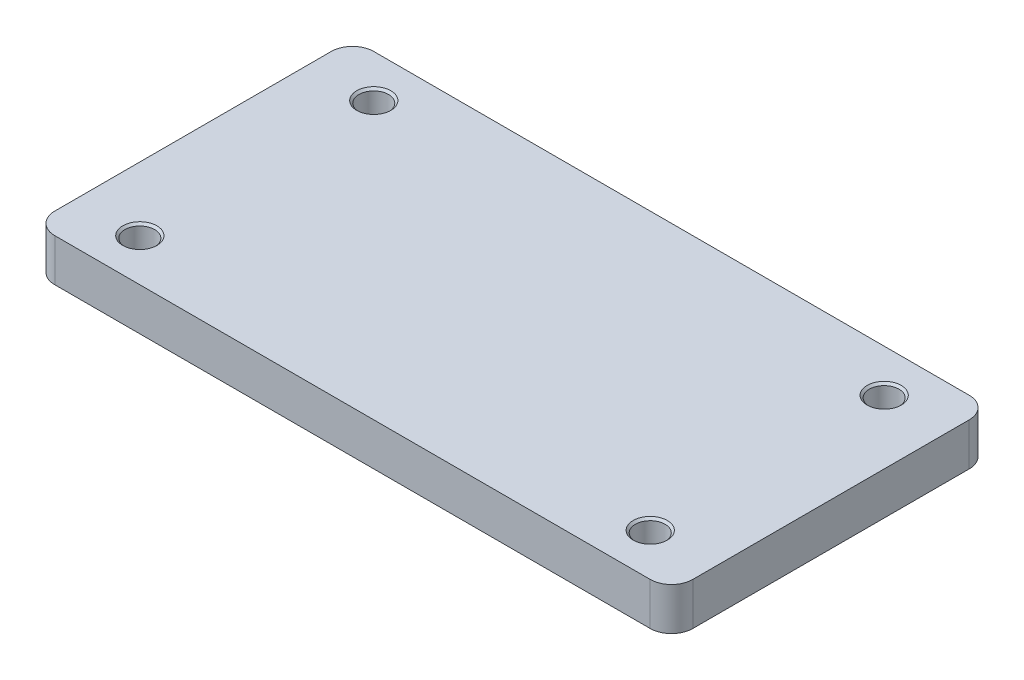
ISO-10303-21;
HEADER;
FILE_DESCRIPTION(('STEP AP214'),'2;1');
FILE_NAME('part.step','',(''),(''),'','','');
FILE_SCHEMA(('AUTOMOTIVE_DESIGN { 1 0 10303 214 1 1 1 1 }'));
ENDSEC;
DATA;
#1=APPLICATION_CONTEXT('core data for automotive mechanical design processes');
#2=APPLICATION_PROTOCOL_DEFINITION('international standard','automotive_design',2000,#1);
#3=PRODUCT_CONTEXT('',#1,'mechanical');
#4=PRODUCT('Part','Part','',(#3));
#5=PRODUCT_RELATED_PRODUCT_CATEGORY('part','',(#4));
#6=PRODUCT_DEFINITION_FORMATION('','',#4);
#7=PRODUCT_DEFINITION_CONTEXT('part definition',#1,'design');
#8=PRODUCT_DEFINITION('design','',#6,#7);
#9=PRODUCT_DEFINITION_SHAPE('','',#8);
#10=(LENGTH_UNIT() NAMED_UNIT(*) SI_UNIT(.MILLI.,.METRE.));
#11=(NAMED_UNIT(*) PLANE_ANGLE_UNIT() SI_UNIT($,.RADIAN.));
#12=(NAMED_UNIT(*) SI_UNIT($,.STERADIAN.) SOLID_ANGLE_UNIT());
#13=UNCERTAINTY_MEASURE_WITH_UNIT(LENGTH_MEASURE(1.E-05),#10,'distance_accuracy_value','');
#14=(GEOMETRIC_REPRESENTATION_CONTEXT(3) GLOBAL_UNCERTAINTY_ASSIGNED_CONTEXT((#13)) GLOBAL_UNIT_ASSIGNED_CONTEXT((#10,
#11,#12)) REPRESENTATION_CONTEXT('',''));
#15=CARTESIAN_POINT('',(0.,0.,0.));
#16=DIRECTION('',(0.,0.,1.));
#17=DIRECTION('',(1.,0.,0.));
#18=AXIS2_PLACEMENT_3D('',#15,#16,#17);
#19=CARTESIAN_POINT('',(150.,10.,-75.));
#20=DIRECTION('',(-1.,0.,0.));
#21=DIRECTION('',(0.,0.,1.));
#22=AXIS2_PLACEMENT_3D('',#19,#20,#21);
#23=PLANE('',#22);
#24=DIRECTION('',(0.,0.,-1.));
#25=VECTOR('',#24,1.);
#26=CARTESIAN_POINT('',(150.,-10.,-75.));
#27=LINE('',#26,#25);
#28=CARTESIAN_POINT('',(150.,-10.,65.));
#29=VERTEX_POINT('',#28);
#30=CARTESIAN_POINT('',(150.,-10.,-65.));
#31=VERTEX_POINT('',#30);
#32=EDGE_CURVE('E138',#29,#31,#27,.T.);
#33=ORIENTED_EDGE('',*,*,#32,.T.);
#34=DIRECTION('',(0.,-1.,0.));
#35=VECTOR('',#34,1.);
#36=CARTESIAN_POINT('',(150.,10.,-65.));
#37=LINE('',#36,#35);
#38=CARTESIAN_POINT('',(150.,10.,-65.));
#39=VERTEX_POINT('',#38);
#40=EDGE_CURVE('E161',#31,#39,#37,.F.);
#41=ORIENTED_EDGE('',*,*,#40,.T.);
#42=DIRECTION('',(0.,0.,-1.));
#43=VECTOR('',#42,1.);
#44=CARTESIAN_POINT('',(150.,10.,-75.));
#45=LINE('',#44,#43);
#46=CARTESIAN_POINT('',(150.,10.,65.));
#47=VERTEX_POINT('',#46);
#48=EDGE_CURVE('E136',#47,#39,#45,.T.);
#49=ORIENTED_EDGE('',*,*,#48,.F.);
#50=DIRECTION('',(0.,-1.,0.));
#51=VECTOR('',#50,1.);
#52=CARTESIAN_POINT('',(150.,10.,65.));
#53=LINE('',#52,#51);
#54=EDGE_CURVE('E158',#47,#29,#53,.T.);
#55=ORIENTED_EDGE('',*,*,#54,.T.);
#56=EDGE_LOOP('',(#33,#41,#49,#55));
#57=FACE_BOUND('',#56,.T.);
#58=ADVANCED_FACE('F43',(#57),#23,.F.);
#59=CARTESIAN_POINT('',(150.,10.,-75.));
#60=DIRECTION('',(0.,0.,1.));
#61=DIRECTION('',(1.,0.,0.));
#62=AXIS2_PLACEMENT_3D('',#59,#60,#61);
#63=PLANE('',#62);
#64=DIRECTION('',(-1.,0.,0.));
#65=VECTOR('',#64,1.);
#66=CARTESIAN_POINT('',(150.,-10.,-75.));
#67=LINE('',#66,#65);
#68=CARTESIAN_POINT('',(140.,-10.,-75.));
#69=VERTEX_POINT('',#68);
#70=CARTESIAN_POINT('',(-140.,-10.,-75.));
#71=VERTEX_POINT('',#70);
#72=EDGE_CURVE('E134',#69,#71,#67,.T.);
#73=ORIENTED_EDGE('',*,*,#72,.T.);
#74=DIRECTION('',(0.,-1.,0.));
#75=VECTOR('',#74,1.);
#76=CARTESIAN_POINT('',(-140.,10.,-75.));
#77=LINE('',#76,#75);
#78=CARTESIAN_POINT('',(-140.,10.,-75.));
#79=VERTEX_POINT('',#78);
#80=EDGE_CURVE('E113',#71,#79,#77,.F.);
#81=ORIENTED_EDGE('',*,*,#80,.T.);
#82=DIRECTION('',(-1.,0.,0.));
#83=VECTOR('',#82,1.);
#84=CARTESIAN_POINT('',(150.,10.,-75.));
#85=LINE('',#84,#83);
#86=CARTESIAN_POINT('',(140.,10.,-75.));
#87=VERTEX_POINT('',#86);
#88=EDGE_CURVE('E177',#87,#79,#85,.T.);
#89=ORIENTED_EDGE('',*,*,#88,.F.);
#90=DIRECTION('',(0.,-1.,0.));
#91=VECTOR('',#90,1.);
#92=CARTESIAN_POINT('',(140.,10.,-75.));
#93=LINE('',#92,#91);
#94=EDGE_CURVE('E118',#87,#69,#93,.T.);
#95=ORIENTED_EDGE('',*,*,#94,.T.);
#96=EDGE_LOOP('',(#73,#81,#89,#95));
#97=FACE_BOUND('',#96,.T.);
#98=ADVANCED_FACE('F239',(#97),#63,.F.);
#99=CARTESIAN_POINT('',(-150.,10.,-75.));
#100=DIRECTION('',(1.,0.,0.));
#101=DIRECTION('',(0.,0.,-1.));
#102=AXIS2_PLACEMENT_3D('',#99,#100,#101);
#103=PLANE('',#102);
#104=DIRECTION('',(0.,0.,1.));
#105=VECTOR('',#104,1.);
#106=CARTESIAN_POINT('',(-150.,10.,-75.));
#107=LINE('',#106,#105);
#108=CARTESIAN_POINT('',(-150.,10.,-65.));
#109=VERTEX_POINT('',#108);
#110=CARTESIAN_POINT('',(-150.,10.,65.));
#111=VERTEX_POINT('',#110);
#112=EDGE_CURVE('E127',#109,#111,#107,.T.);
#113=ORIENTED_EDGE('',*,*,#112,.F.);
#114=DIRECTION('',(0.,-1.,0.));
#115=VECTOR('',#114,1.);
#116=CARTESIAN_POINT('',(-150.,10.,-65.));
#117=LINE('',#116,#115);
#118=CARTESIAN_POINT('',(-150.,-10.,-65.));
#119=VERTEX_POINT('',#118);
#120=EDGE_CURVE('E112',#109,#119,#117,.T.);
#121=ORIENTED_EDGE('',*,*,#120,.T.);
#122=DIRECTION('',(0.,0.,1.));
#123=VECTOR('',#122,1.);
#124=CARTESIAN_POINT('',(-150.,-10.,-75.));
#125=LINE('',#124,#123);
#126=CARTESIAN_POINT('',(-150.,-10.,65.));
#127=VERTEX_POINT('',#126);
#128=EDGE_CURVE('E125',#119,#127,#125,.T.);
#129=ORIENTED_EDGE('',*,*,#128,.T.);
#130=DIRECTION('',(0.,-1.,0.));
#131=VECTOR('',#130,1.);
#132=CARTESIAN_POINT('',(-150.,10.,65.));
#133=LINE('',#132,#131);
#134=EDGE_CURVE('E129',#127,#111,#133,.F.);
#135=ORIENTED_EDGE('',*,*,#134,.T.);
#136=EDGE_LOOP('',(#113,#121,#129,#135));
#137=FACE_BOUND('',#136,.T.);
#138=ADVANCED_FACE('F124',(#137),#103,.F.);
#139=CARTESIAN_POINT('',(150.,10.,75.));
#140=DIRECTION('',(0.,0.,-1.));
#141=DIRECTION('',(-1.,0.,0.));
#142=AXIS2_PLACEMENT_3D('',#139,#140,#141);
#143=PLANE('',#142);
#144=DIRECTION('',(1.,0.,0.));
#145=VECTOR('',#144,1.);
#146=CARTESIAN_POINT('',(150.,-10.,75.));
#147=LINE('',#146,#145);
#148=CARTESIAN_POINT('',(-140.,-10.,75.));
#149=VERTEX_POINT('',#148);
#150=CARTESIAN_POINT('',(140.,-10.,75.));
#151=VERTEX_POINT('',#150);
#152=EDGE_CURVE('E133',#149,#151,#147,.T.);
#153=ORIENTED_EDGE('',*,*,#152,.T.);
#154=DIRECTION('',(0.,-1.,0.));
#155=VECTOR('',#154,1.);
#156=CARTESIAN_POINT('',(140.,10.,75.));
#157=LINE('',#156,#155);
#158=CARTESIAN_POINT('',(140.,10.,75.));
#159=VERTEX_POINT('',#158);
#160=EDGE_CURVE('E11',#151,#159,#157,.F.);
#161=ORIENTED_EDGE('',*,*,#160,.T.);
#162=DIRECTION('',(1.,0.,0.));
#163=VECTOR('',#162,1.);
#164=CARTESIAN_POINT('',(150.,10.,75.));
#165=LINE('',#164,#163);
#166=CARTESIAN_POINT('',(-140.,10.,75.));
#167=VERTEX_POINT('',#166);
#168=EDGE_CURVE('E142',#167,#159,#165,.T.);
#169=ORIENTED_EDGE('',*,*,#168,.F.);
#170=DIRECTION('',(0.,-1.,0.));
#171=VECTOR('',#170,1.);
#172=CARTESIAN_POINT('',(-140.,10.,75.));
#173=LINE('',#172,#171);
#174=EDGE_CURVE('E51',#167,#149,#173,.T.);
#175=ORIENTED_EDGE('',*,*,#174,.T.);
#176=EDGE_LOOP('',(#153,#161,#169,#175));
#177=FACE_BOUND('',#176,.T.);
#178=ADVANCED_FACE('F164',(#177),#143,.F.);
#179=CARTESIAN_POINT('',(0.,10.,0.));
#180=DIRECTION('',(0.,-1.,0.));
#181=DIRECTION('',(0.,0.,-1.));
#182=AXIS2_PLACEMENT_3D('',#179,#180,#181);
#183=PLANE('',#182);
#184=CARTESIAN_POINT('',(-120.,10.,-55.));
#185=DIRECTION('',(0.,1.,0.));
#186=DIRECTION('',(0.,0.,1.));
#187=AXIS2_PLACEMENT_3D('',#184,#185,#186);
#188=CIRCLE('',#187,8.025);
#189=CARTESIAN_POINT('',(-120.,10.,-46.975));
#190=VERTEX_POINT('',#189);
#191=EDGE_CURVE('E221',#190,#190,#188,.T.);
#192=ORIENTED_EDGE('',*,*,#191,.F.);
#193=EDGE_LOOP('',(#192));
#194=FACE_BOUND('',#193,.T.);
#195=CARTESIAN_POINT('',(120.,10.,-55.));
#196=DIRECTION('',(0.,1.,0.));
#197=DIRECTION('',(0.,0.,1.));
#198=AXIS2_PLACEMENT_3D('',#195,#196,#197);
#199=CIRCLE('',#198,8.025);
#200=CARTESIAN_POINT('',(120.,10.,-46.975));
#201=VERTEX_POINT('',#200);
#202=EDGE_CURVE('E212',#201,#201,#199,.T.);
#203=ORIENTED_EDGE('',*,*,#202,.F.);
#204=EDGE_LOOP('',(#203));
#205=FACE_BOUND('',#204,.T.);
#206=CARTESIAN_POINT('',(120.,10.,55.));
#207=DIRECTION('',(0.,1.,0.));
#208=DIRECTION('',(0.,0.,1.));
#209=AXIS2_PLACEMENT_3D('',#206,#207,#208);
#210=CIRCLE('',#209,8.02499999999999);
#211=CARTESIAN_POINT('',(120.,10.,63.025));
#212=VERTEX_POINT('',#211);
#213=EDGE_CURVE('E203',#212,#212,#210,.T.);
#214=ORIENTED_EDGE('',*,*,#213,.F.);
#215=EDGE_LOOP('',(#214));
#216=FACE_BOUND('',#215,.T.);
#217=CARTESIAN_POINT('',(-120.,10.,55.));
#218=DIRECTION('',(0.,1.,0.));
#219=DIRECTION('',(0.,0.,1.));
#220=AXIS2_PLACEMENT_3D('',#217,#218,#219);
#221=CIRCLE('',#220,8.025);
#222=CARTESIAN_POINT('',(-120.,10.,63.025));
#223=VERTEX_POINT('',#222);
#224=EDGE_CURVE('E191',#223,#223,#221,.T.);
#225=ORIENTED_EDGE('',*,*,#224,.F.);
#226=EDGE_LOOP('',(#225));
#227=FACE_BOUND('',#226,.T.);
#228=ORIENTED_EDGE('',*,*,#88,.T.);
#229=CARTESIAN_POINT('',(-140.,10.,-65.));
#230=DIRECTION('',(0.,-1.,0.));
#231=DIRECTION('',(0.,0.,-1.));
#232=AXIS2_PLACEMENT_3D('',#229,#230,#231);
#233=CIRCLE('',#232,10.);
#234=EDGE_CURVE('E156',#79,#109,#233,.F.);
#235=ORIENTED_EDGE('',*,*,#234,.T.);
#236=ORIENTED_EDGE('',*,*,#112,.T.);
#237=CARTESIAN_POINT('',(-140.,10.,65.));
#238=DIRECTION('',(0.,-1.,0.));
#239=DIRECTION('',(0.,0.,-1.));
#240=AXIS2_PLACEMENT_3D('',#237,#238,#239);
#241=CIRCLE('',#240,10.);
#242=EDGE_CURVE('E63',#111,#167,#241,.F.);
#243=ORIENTED_EDGE('',*,*,#242,.T.);
#244=ORIENTED_EDGE('',*,*,#168,.T.);
#245=CARTESIAN_POINT('',(140.,10.,65.));
#246=DIRECTION('',(0.,-1.,0.));
#247=DIRECTION('',(0.,0.,-1.));
#248=AXIS2_PLACEMENT_3D('',#245,#246,#247);
#249=CIRCLE('',#248,10.);
#250=EDGE_CURVE('E152',#159,#47,#249,.F.);
#251=ORIENTED_EDGE('',*,*,#250,.T.);
#252=ORIENTED_EDGE('',*,*,#48,.T.);
#253=CARTESIAN_POINT('',(140.,10.,-65.));
#254=DIRECTION('',(0.,-1.,0.));
#255=DIRECTION('',(0.,0.,-1.));
#256=AXIS2_PLACEMENT_3D('',#253,#254,#255);
#257=CIRCLE('',#256,10.);
#258=EDGE_CURVE('E154',#39,#87,#257,.F.);
#259=ORIENTED_EDGE('',*,*,#258,.T.);
#260=EDGE_LOOP('',(#228,#235,#236,#243,#244,#251,#252,#259));
#261=FACE_BOUND('',#260,.T.);
#262=ADVANCED_FACE('F227',(#194,#205,#216,#227,#261),#183,.F.);
#263=CARTESIAN_POINT('',(0.,-10.,0.));
#264=DIRECTION('',(0.,-1.,0.));
#265=DIRECTION('',(0.,0.,-1.));
#266=AXIS2_PLACEMENT_3D('',#263,#264,#265);
#267=PLANE('',#266);
#268=CARTESIAN_POINT('',(-120.,-10.,-55.));
#269=DIRECTION('',(0.,1.,0.));
#270=DIRECTION('',(0.,0.,1.));
#271=AXIS2_PLACEMENT_3D('',#268,#269,#270);
#272=CIRCLE('',#271,7.00000000000001);
#273=CARTESIAN_POINT('',(-120.,-10.,-48.));
#274=VERTEX_POINT('',#273);
#275=EDGE_CURVE('E215',#274,#274,#272,.T.);
#276=ORIENTED_EDGE('',*,*,#275,.T.);
#277=EDGE_LOOP('',(#276));
#278=FACE_BOUND('',#277,.T.);
#279=CARTESIAN_POINT('',(120.,-10.,-55.));
#280=DIRECTION('',(0.,1.,0.));
#281=DIRECTION('',(0.,0.,1.));
#282=AXIS2_PLACEMENT_3D('',#279,#280,#281);
#283=CIRCLE('',#282,7.00000000000001);
#284=CARTESIAN_POINT('',(120.,-10.,-48.));
#285=VERTEX_POINT('',#284);
#286=EDGE_CURVE('E206',#285,#285,#283,.T.);
#287=ORIENTED_EDGE('',*,*,#286,.T.);
#288=EDGE_LOOP('',(#287));
#289=FACE_BOUND('',#288,.T.);
#290=CARTESIAN_POINT('',(120.,-10.,55.));
#291=DIRECTION('',(0.,1.,0.));
#292=DIRECTION('',(0.,0.,1.));
#293=AXIS2_PLACEMENT_3D('',#290,#291,#292);
#294=CIRCLE('',#293,6.99999999999999);
#295=CARTESIAN_POINT('',(120.,-10.,62.));
#296=VERTEX_POINT('',#295);
#297=EDGE_CURVE('E195',#296,#296,#294,.T.);
#298=ORIENTED_EDGE('',*,*,#297,.T.);
#299=EDGE_LOOP('',(#298));
#300=FACE_BOUND('',#299,.T.);
#301=CARTESIAN_POINT('',(-120.,-10.,55.));
#302=DIRECTION('',(0.,1.,0.));
#303=DIRECTION('',(0.,0.,1.));
#304=AXIS2_PLACEMENT_3D('',#301,#302,#303);
#305=CIRCLE('',#304,7.00000000000001);
#306=CARTESIAN_POINT('',(-120.,-10.,62.));
#307=VERTEX_POINT('',#306);
#308=EDGE_CURVE('E182',#307,#307,#305,.T.);
#309=ORIENTED_EDGE('',*,*,#308,.T.);
#310=EDGE_LOOP('',(#309));
#311=FACE_BOUND('',#310,.T.);
#312=ORIENTED_EDGE('',*,*,#128,.F.);
#313=CARTESIAN_POINT('',(-140.,-10.,-65.));
#314=DIRECTION('',(0.,-1.,0.));
#315=DIRECTION('',(0.,0.,-1.));
#316=AXIS2_PLACEMENT_3D('',#313,#314,#315);
#317=CIRCLE('',#316,10.);
#318=EDGE_CURVE('E108',#119,#71,#317,.T.);
#319=ORIENTED_EDGE('',*,*,#318,.T.);
#320=ORIENTED_EDGE('',*,*,#72,.F.);
#321=CARTESIAN_POINT('',(140.,-10.,-65.));
#322=DIRECTION('',(0.,-1.,0.));
#323=DIRECTION('',(0.,0.,-1.));
#324=AXIS2_PLACEMENT_3D('',#321,#322,#323);
#325=CIRCLE('',#324,10.);
#326=EDGE_CURVE('E119',#69,#31,#325,.T.);
#327=ORIENTED_EDGE('',*,*,#326,.T.);
#328=ORIENTED_EDGE('',*,*,#32,.F.);
#329=CARTESIAN_POINT('',(140.,-10.,65.));
#330=DIRECTION('',(0.,-1.,0.));
#331=DIRECTION('',(0.,0.,-1.));
#332=AXIS2_PLACEMENT_3D('',#329,#330,#331);
#333=CIRCLE('',#332,10.);
#334=EDGE_CURVE('E145',#29,#151,#333,.T.);
#335=ORIENTED_EDGE('',*,*,#334,.T.);
#336=ORIENTED_EDGE('',*,*,#152,.F.);
#337=CARTESIAN_POINT('',(-140.,-10.,65.));
#338=DIRECTION('',(0.,-1.,0.));
#339=DIRECTION('',(0.,0.,-1.));
#340=AXIS2_PLACEMENT_3D('',#337,#338,#339);
#341=CIRCLE('',#340,10.);
#342=EDGE_CURVE('E128',#149,#127,#341,.T.);
#343=ORIENTED_EDGE('',*,*,#342,.T.);
#344=EDGE_LOOP('',(#312,#319,#320,#327,#328,#335,#336,#343));
#345=FACE_BOUND('',#344,.T.);
#346=ADVANCED_FACE('F131',(#278,#289,#300,#311,#345),#267,.T.);
#347=CARTESIAN_POINT('',(-140.,10.,-65.));
#348=DIRECTION('',(0.,-1.,0.));
#349=DIRECTION('',(0.,0.,-1.));
#350=AXIS2_PLACEMENT_3D('',#347,#348,#349);
#351=CYLINDRICAL_SURFACE('',#350,10.);
#352=ORIENTED_EDGE('',*,*,#234,.F.);
#353=ORIENTED_EDGE('',*,*,#80,.F.);
#354=ORIENTED_EDGE('',*,*,#318,.F.);
#355=ORIENTED_EDGE('',*,*,#120,.F.);
#356=EDGE_LOOP('',(#352,#353,#354,#355));
#357=FACE_BOUND('',#356,.T.);
#358=ADVANCED_FACE('F111',(#357),#351,.T.);
#359=CARTESIAN_POINT('',(140.,10.,-65.));
#360=DIRECTION('',(0.,-1.,0.));
#361=DIRECTION('',(0.,0.,-1.));
#362=AXIS2_PLACEMENT_3D('',#359,#360,#361);
#363=CYLINDRICAL_SURFACE('',#362,10.);
#364=ORIENTED_EDGE('',*,*,#258,.F.);
#365=ORIENTED_EDGE('',*,*,#40,.F.);
#366=ORIENTED_EDGE('',*,*,#326,.F.);
#367=ORIENTED_EDGE('',*,*,#94,.F.);
#368=EDGE_LOOP('',(#364,#365,#366,#367));
#369=FACE_BOUND('',#368,.T.);
#370=ADVANCED_FACE('F241',(#369),#363,.T.);
#371=CARTESIAN_POINT('',(140.,10.,65.));
#372=DIRECTION('',(0.,-1.,0.));
#373=DIRECTION('',(0.,0.,-1.));
#374=AXIS2_PLACEMENT_3D('',#371,#372,#373);
#375=CYLINDRICAL_SURFACE('',#374,10.);
#376=ORIENTED_EDGE('',*,*,#250,.F.);
#377=ORIENTED_EDGE('',*,*,#160,.F.);
#378=ORIENTED_EDGE('',*,*,#334,.F.);
#379=ORIENTED_EDGE('',*,*,#54,.F.);
#380=EDGE_LOOP('',(#376,#377,#378,#379));
#381=FACE_BOUND('',#380,.T.);
#382=ADVANCED_FACE('F171',(#381),#375,.T.);
#383=CARTESIAN_POINT('',(-140.,10.,65.));
#384=DIRECTION('',(0.,-1.,0.));
#385=DIRECTION('',(0.,0.,-1.));
#386=AXIS2_PLACEMENT_3D('',#383,#384,#385);
#387=CYLINDRICAL_SURFACE('',#386,10.);
#388=ORIENTED_EDGE('',*,*,#242,.F.);
#389=ORIENTED_EDGE('',*,*,#134,.F.);
#390=ORIENTED_EDGE('',*,*,#342,.F.);
#391=ORIENTED_EDGE('',*,*,#174,.F.);
#392=EDGE_LOOP('',(#388,#389,#390,#391));
#393=FACE_BOUND('',#392,.T.);
#394=ADVANCED_FACE('F45',(#393),#387,.T.);
#395=CARTESIAN_POINT('',(-120.,10.,55.));
#396=DIRECTION('',(0.,1.,0.));
#397=DIRECTION('',(0.,0.,1.));
#398=AXIS2_PLACEMENT_3D('',#395,#396,#397);
#399=CYLINDRICAL_SURFACE('',#398,7.00000000000001);
#400=ORIENTED_EDGE('',*,*,#308,.F.);
#401=EDGE_LOOP('',(#400));
#402=FACE_BOUND('',#401,.T.);
#403=CARTESIAN_POINT('',(-120.,8.975,55.));
#404=DIRECTION('',(0.,1.,0.));
#405=DIRECTION('',(0.,0.,1.));
#406=AXIS2_PLACEMENT_3D('',#403,#404,#405);
#407=CIRCLE('',#406,7.00000000000001);
#408=CARTESIAN_POINT('',(-120.,8.975,62.));
#409=VERTEX_POINT('',#408);
#410=EDGE_CURVE('E187',#409,#409,#407,.T.);
#411=ORIENTED_EDGE('',*,*,#410,.T.);
#412=EDGE_LOOP('',(#411));
#413=FACE_BOUND('',#412,.T.);
#414=ADVANCED_FACE('F263',(#402,#413),#399,.F.);
#415=CARTESIAN_POINT('',(-120.,10.,55.));
#416=DIRECTION('',(0.,1.,0.));
#417=DIRECTION('',(0.,0.,1.));
#418=AXIS2_PLACEMENT_3D('',#415,#416,#417);
#419=CONICAL_SURFACE('',#418,8.025,0.785398163397448);
#420=ORIENTED_EDGE('',*,*,#410,.F.);
#421=EDGE_LOOP('',(#420));
#422=FACE_BOUND('',#421,.T.);
#423=ORIENTED_EDGE('',*,*,#224,.T.);
#424=EDGE_LOOP('',(#423));
#425=FACE_BOUND('',#424,.T.);
#426=ADVANCED_FACE('F266',(#422,#425),#419,.F.);
#427=CARTESIAN_POINT('',(120.,10.,55.));
#428=DIRECTION('',(0.,1.,0.));
#429=DIRECTION('',(0.,0.,1.));
#430=AXIS2_PLACEMENT_3D('',#427,#428,#429);
#431=CYLINDRICAL_SURFACE('',#430,6.99999999999999);
#432=ORIENTED_EDGE('',*,*,#297,.F.);
#433=EDGE_LOOP('',(#432));
#434=FACE_BOUND('',#433,.T.);
#435=CARTESIAN_POINT('',(120.,8.975,55.));
#436=DIRECTION('',(0.,1.,0.));
#437=DIRECTION('',(0.,0.,1.));
#438=AXIS2_PLACEMENT_3D('',#435,#436,#437);
#439=CIRCLE('',#438,6.99999999999999);
#440=CARTESIAN_POINT('',(120.,8.975,62.));
#441=VERTEX_POINT('',#440);
#442=EDGE_CURVE('E200',#441,#441,#439,.T.);
#443=ORIENTED_EDGE('',*,*,#442,.T.);
#444=EDGE_LOOP('',(#443));
#445=FACE_BOUND('',#444,.T.);
#446=ADVANCED_FACE('F270',(#434,#445),#431,.F.);
#447=CARTESIAN_POINT('',(120.,10.,55.));
#448=DIRECTION('',(0.,1.,0.));
#449=DIRECTION('',(0.,0.,1.));
#450=AXIS2_PLACEMENT_3D('',#447,#448,#449);
#451=CONICAL_SURFACE('',#450,8.02499999999999,0.785398163397448);
#452=ORIENTED_EDGE('',*,*,#442,.F.);
#453=EDGE_LOOP('',(#452));
#454=FACE_BOUND('',#453,.T.);
#455=ORIENTED_EDGE('',*,*,#213,.T.);
#456=EDGE_LOOP('',(#455));
#457=FACE_BOUND('',#456,.T.);
#458=ADVANCED_FACE('F274',(#454,#457),#451,.F.);
#459=CARTESIAN_POINT('',(120.,10.,-55.));
#460=DIRECTION('',(0.,1.,0.));
#461=DIRECTION('',(0.,0.,1.));
#462=AXIS2_PLACEMENT_3D('',#459,#460,#461);
#463=CYLINDRICAL_SURFACE('',#462,7.00000000000001);
#464=ORIENTED_EDGE('',*,*,#286,.F.);
#465=EDGE_LOOP('',(#464));
#466=FACE_BOUND('',#465,.T.);
#467=CARTESIAN_POINT('',(120.,8.975,-55.));
#468=DIRECTION('',(0.,1.,0.));
#469=DIRECTION('',(0.,0.,1.));
#470=AXIS2_PLACEMENT_3D('',#467,#468,#469);
#471=CIRCLE('',#470,7.00000000000001);
#472=CARTESIAN_POINT('',(120.,8.975,-48.));
#473=VERTEX_POINT('',#472);
#474=EDGE_CURVE('E209',#473,#473,#471,.T.);
#475=ORIENTED_EDGE('',*,*,#474,.T.);
#476=EDGE_LOOP('',(#475));
#477=FACE_BOUND('',#476,.T.);
#478=ADVANCED_FACE('F278',(#466,#477),#463,.F.);
#479=CARTESIAN_POINT('',(120.,10.,-55.));
#480=DIRECTION('',(0.,1.,0.));
#481=DIRECTION('',(0.,0.,1.));
#482=AXIS2_PLACEMENT_3D('',#479,#480,#481);
#483=CONICAL_SURFACE('',#482,8.025,0.785398163397448);
#484=ORIENTED_EDGE('',*,*,#474,.F.);
#485=EDGE_LOOP('',(#484));
#486=FACE_BOUND('',#485,.T.);
#487=ORIENTED_EDGE('',*,*,#202,.T.);
#488=EDGE_LOOP('',(#487));
#489=FACE_BOUND('',#488,.T.);
#490=ADVANCED_FACE('F282',(#486,#489),#483,.F.);
#491=CARTESIAN_POINT('',(-120.,10.,-55.));
#492=DIRECTION('',(0.,1.,0.));
#493=DIRECTION('',(0.,0.,1.));
#494=AXIS2_PLACEMENT_3D('',#491,#492,#493);
#495=CYLINDRICAL_SURFACE('',#494,7.00000000000001);
#496=ORIENTED_EDGE('',*,*,#275,.F.);
#497=EDGE_LOOP('',(#496));
#498=FACE_BOUND('',#497,.T.);
#499=CARTESIAN_POINT('',(-120.,8.975,-55.));
#500=DIRECTION('',(0.,1.,0.));
#501=DIRECTION('',(0.,0.,1.));
#502=AXIS2_PLACEMENT_3D('',#499,#500,#501);
#503=CIRCLE('',#502,7.00000000000001);
#504=CARTESIAN_POINT('',(-120.,8.975,-48.));
#505=VERTEX_POINT('',#504);
#506=EDGE_CURVE('E218',#505,#505,#503,.T.);
#507=ORIENTED_EDGE('',*,*,#506,.T.);
#508=EDGE_LOOP('',(#507));
#509=FACE_BOUND('',#508,.T.);
#510=ADVANCED_FACE('F286',(#498,#509),#495,.F.);
#511=CARTESIAN_POINT('',(-120.,10.,-55.));
#512=DIRECTION('',(0.,1.,0.));
#513=DIRECTION('',(0.,0.,1.));
#514=AXIS2_PLACEMENT_3D('',#511,#512,#513);
#515=CONICAL_SURFACE('',#514,8.025,0.785398163397448);
#516=ORIENTED_EDGE('',*,*,#506,.F.);
#517=EDGE_LOOP('',(#516));
#518=FACE_BOUND('',#517,.T.);
#519=ORIENTED_EDGE('',*,*,#191,.T.);
#520=EDGE_LOOP('',(#519));
#521=FACE_BOUND('',#520,.T.);
#522=ADVANCED_FACE('F225',(#518,#521),#515,.F.);
#523=CLOSED_SHELL('',(#58,#98,#138,#178,#262,#346,#358,#370,#382,#394,#414,#426,#446,#458,#478,
#490,#510,#522));
#524=MANIFOLD_SOLID_BREP('B2',#523);
#525=ADVANCED_BREP_SHAPE_REPRESENTATION('',(#18,#524),#14);
#526=SHAPE_DEFINITION_REPRESENTATION(#9,#525);
ENDSEC;
END-ISO-10303-21;
